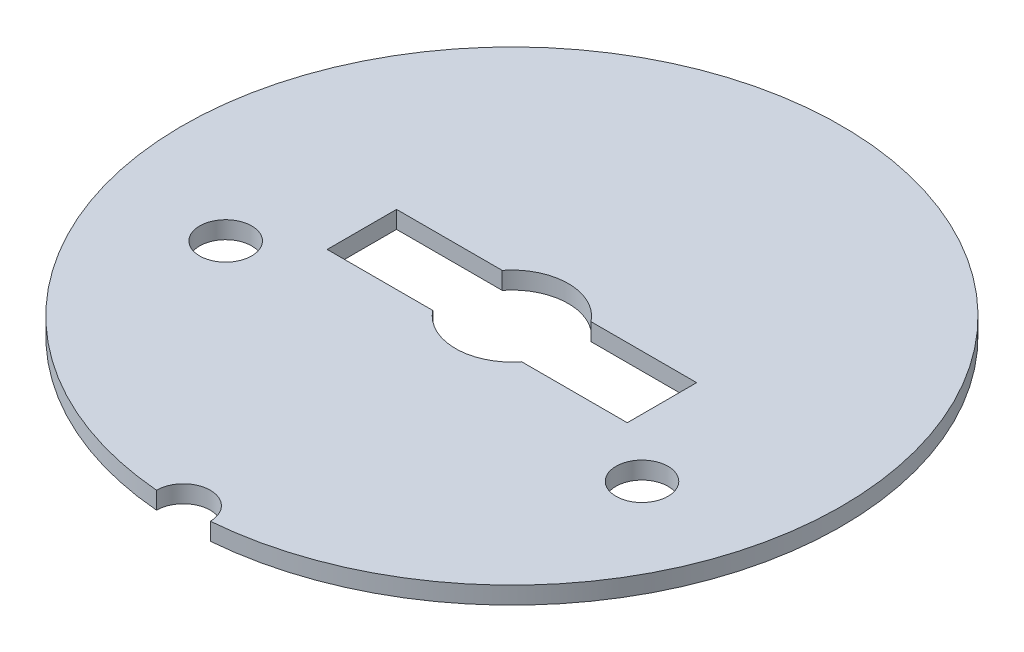
ISO-10303-21;
HEADER;
FILE_DESCRIPTION(('STEP AP214'),'2;1');
FILE_NAME('part.step','',(''),(''),'','','');
FILE_SCHEMA(('AUTOMOTIVE_DESIGN { 1 0 10303 214 1 1 1 1 }'));
ENDSEC;
DATA;
#1=APPLICATION_CONTEXT('core data for automotive mechanical design processes');
#2=APPLICATION_PROTOCOL_DEFINITION('international standard','automotive_design',2000,#1);
#3=PRODUCT_CONTEXT('',#1,'mechanical');
#4=PRODUCT('Part','Part','',(#3));
#5=PRODUCT_RELATED_PRODUCT_CATEGORY('part','',(#4));
#6=PRODUCT_DEFINITION_FORMATION('','',#4);
#7=PRODUCT_DEFINITION_CONTEXT('part definition',#1,'design');
#8=PRODUCT_DEFINITION('design','',#6,#7);
#9=PRODUCT_DEFINITION_SHAPE('','',#8);
#10=(LENGTH_UNIT() NAMED_UNIT(*) SI_UNIT(.MILLI.,.METRE.));
#11=(NAMED_UNIT(*) PLANE_ANGLE_UNIT() SI_UNIT($,.RADIAN.));
#12=(NAMED_UNIT(*) SI_UNIT($,.STERADIAN.) SOLID_ANGLE_UNIT());
#13=UNCERTAINTY_MEASURE_WITH_UNIT(LENGTH_MEASURE(1.E-05),#10,'distance_accuracy_value','');
#14=(GEOMETRIC_REPRESENTATION_CONTEXT(3) GLOBAL_UNCERTAINTY_ASSIGNED_CONTEXT((#13)) GLOBAL_UNIT_ASSIGNED_CONTEXT((#10,
#11,#12)) REPRESENTATION_CONTEXT('',''));
#15=CARTESIAN_POINT('',(0.,0.,0.));
#16=DIRECTION('',(0.,0.,1.));
#17=DIRECTION('',(1.,0.,0.));
#18=AXIS2_PLACEMENT_3D('',#15,#16,#17);
#19=CARTESIAN_POINT('',(0.,20.32,24.0495718828839));
#20=DIRECTION('',(0.,1.,0.));
#21=DIRECTION('',(0.,0.,1.));
#22=AXIS2_PLACEMENT_3D('',#19,#20,#21);
#23=PLANE('',#22);
#24=CARTESIAN_POINT('',(-30.48,20.32,11.43));
#25=DIRECTION('',(0.,1.,0.));
#26=DIRECTION('',(0.,0.,1.));
#27=AXIS2_PLACEMENT_3D('',#24,#25,#26);
#28=CIRCLE('',#27,3.81);
#29=CARTESIAN_POINT('',(-30.48,20.32,15.24));
#30=VERTEX_POINT('',#29);
#31=EDGE_CURVE('E132',#30,#30,#28,.F.);
#32=ORIENTED_EDGE('',*,*,#31,.T.);
#33=EDGE_LOOP('',(#32));
#34=FACE_BOUND('',#33,.T.);
#35=CARTESIAN_POINT('',(30.48,20.32,11.43));
#36=DIRECTION('',(0.,1.,0.));
#37=DIRECTION('',(0.,0.,1.));
#38=AXIS2_PLACEMENT_3D('',#35,#36,#37);
#39=CIRCLE('',#38,3.81);
#40=CARTESIAN_POINT('',(30.48,20.32,15.24));
#41=VERTEX_POINT('',#40);
#42=EDGE_CURVE('E155',#41,#41,#39,.F.);
#43=ORIENTED_EDGE('',*,*,#42,.T.);
#44=EDGE_LOOP('',(#43));
#45=FACE_BOUND('',#44,.T.);
#46=CARTESIAN_POINT('',(0.,20.32,48.0991437657678));
#47=DIRECTION('',(0.,-1.,0.));
#48=DIRECTION('',(0.,0.,1.));
#49=AXIS2_PLACEMENT_3D('',#46,#47,#48);
#50=CIRCLE('',#49,3.937);
#51=CARTESIAN_POINT('',(-3.937,20.32,48.0991437657678));
#52=VERTEX_POINT('',#51);
#53=CARTESIAN_POINT('',(3.937,20.32,48.0991437657678));
#54=VERTEX_POINT('',#53);
#55=EDGE_CURVE('E199',#52,#54,#50,.T.);
#56=ORIENTED_EDGE('',*,*,#55,.T.);
#57=CARTESIAN_POINT('',(0.,20.32,0.));
#58=DIRECTION('',(0.,1.,0.));
#59=DIRECTION('',(0.,0.,1.));
#60=AXIS2_PLACEMENT_3D('',#57,#58,#59);
#61=CIRCLE('',#60,48.26);
#62=EDGE_CURVE('E135',#54,#52,#61,.T.);
#63=ORIENTED_EDGE('',*,*,#62,.T.);
#64=EDGE_LOOP('',(#56,#63));
#65=FACE_BOUND('',#64,.T.);
#66=CARTESIAN_POINT('',(0.,20.32,0.));
#67=DIRECTION('',(0.,1.,0.));
#68=DIRECTION('',(0.,0.,1.));
#69=AXIS2_PLACEMENT_3D('',#66,#67,#68);
#70=CIRCLE('',#69,8.255);
#71=CARTESIAN_POINT('',(-6.50681373638434,20.32,-5.08));
#72=VERTEX_POINT('',#71);
#73=CARTESIAN_POINT('',(6.50681373638434,20.32,-5.08));
#74=VERTEX_POINT('',#73);
#75=EDGE_CURVE('E147',#72,#74,#70,.F.);
#76=ORIENTED_EDGE('',*,*,#75,.T.);
#77=DIRECTION('',(1.,0.,0.));
#78=VECTOR('',#77,1.);
#79=CARTESIAN_POINT('',(0.,20.32,-5.08));
#80=LINE('',#79,#78);
#81=CARTESIAN_POINT('',(21.971,20.32,-5.08));
#82=VERTEX_POINT('',#81);
#83=EDGE_CURVE('E190',#74,#82,#80,.T.);
#84=ORIENTED_EDGE('',*,*,#83,.T.);
#85=DIRECTION('',(0.,0.,1.));
#86=VECTOR('',#85,1.);
#87=CARTESIAN_POINT('',(21.971,20.32,24.0495718828839));
#88=LINE('',#87,#86);
#89=CARTESIAN_POINT('',(21.971,20.32,5.08));
#90=VERTEX_POINT('',#89);
#91=EDGE_CURVE('E150',#82,#90,#88,.T.);
#92=ORIENTED_EDGE('',*,*,#91,.T.);
#93=DIRECTION('',(-1.,0.,0.));
#94=VECTOR('',#93,1.);
#95=CARTESIAN_POINT('',(0.,20.32,5.08));
#96=LINE('',#95,#94);
#97=CARTESIAN_POINT('',(6.50681373638434,20.32,5.08));
#98=VERTEX_POINT('',#97);
#99=EDGE_CURVE('E181',#90,#98,#96,.T.);
#100=ORIENTED_EDGE('',*,*,#99,.T.);
#101=CARTESIAN_POINT('',(-6.50681373638434,20.32,5.08));
#102=VERTEX_POINT('',#101);
#103=EDGE_CURVE('E125',#98,#102,#70,.F.);
#104=ORIENTED_EDGE('',*,*,#103,.T.);
#105=CARTESIAN_POINT('',(-21.971,20.32,5.08));
#106=VERTEX_POINT('',#105);
#107=EDGE_CURVE('E177',#102,#106,#96,.T.);
#108=ORIENTED_EDGE('',*,*,#107,.T.);
#109=DIRECTION('',(0.,0.,-1.));
#110=VECTOR('',#109,1.);
#111=CARTESIAN_POINT('',(-21.971,20.32,24.0495718828839));
#112=LINE('',#111,#110);
#113=CARTESIAN_POINT('',(-21.971,20.32,-5.08));
#114=VERTEX_POINT('',#113);
#115=EDGE_CURVE('E184',#106,#114,#112,.T.);
#116=ORIENTED_EDGE('',*,*,#115,.T.);
#117=EDGE_CURVE('E194',#114,#72,#80,.T.);
#118=ORIENTED_EDGE('',*,*,#117,.T.);
#119=EDGE_LOOP('',(#76,#84,#92,#100,#104,#108,#116,#118));
#120=FACE_BOUND('',#119,.T.);
#121=ADVANCED_FACE('F37',(#34,#45,#65,#120),#23,.T.);
#122=CARTESIAN_POINT('',(21.971,38.608,5.08));
#123=DIRECTION('',(-1.,0.,0.));
#124=DIRECTION('',(0.,0.,1.));
#125=AXIS2_PLACEMENT_3D('',#122,#123,#124);
#126=PLANE('',#125);
#127=DIRECTION('',(0.,-1.,0.));
#128=VECTOR('',#127,1.);
#129=CARTESIAN_POINT('',(21.971,38.608,-5.08));
#130=LINE('',#129,#128);
#131=CARTESIAN_POINT('',(21.971,17.78,-5.08));
#132=VERTEX_POINT('',#131);
#133=EDGE_CURVE('E173',#82,#132,#130,.T.);
#134=ORIENTED_EDGE('',*,*,#133,.T.);
#135=DIRECTION('',(0.,0.,1.));
#136=VECTOR('',#135,1.);
#137=CARTESIAN_POINT('',(21.971,17.78,0.));
#138=LINE('',#137,#136);
#139=CARTESIAN_POINT('',(21.971,17.78,5.08));
#140=VERTEX_POINT('',#139);
#141=EDGE_CURVE('E46',#132,#140,#138,.T.);
#142=ORIENTED_EDGE('',*,*,#141,.T.);
#143=DIRECTION('',(0.,-1.,0.));
#144=VECTOR('',#143,1.);
#145=CARTESIAN_POINT('',(21.971,38.608,5.08));
#146=LINE('',#145,#144);
#147=EDGE_CURVE('E55',#90,#140,#146,.T.);
#148=ORIENTED_EDGE('',*,*,#147,.F.);
#149=ORIENTED_EDGE('',*,*,#91,.F.);
#150=EDGE_LOOP('',(#134,#142,#148,#149));
#151=FACE_BOUND('',#150,.T.);
#152=ADVANCED_FACE('F203',(#151),#126,.T.);
#153=CARTESIAN_POINT('',(-21.971,38.608,5.08));
#154=DIRECTION('',(0.,0.,-1.));
#155=DIRECTION('',(-1.,0.,0.));
#156=AXIS2_PLACEMENT_3D('',#153,#154,#155);
#157=PLANE('',#156);
#158=ORIENTED_EDGE('',*,*,#147,.T.);
#159=DIRECTION('',(-1.,0.,0.));
#160=VECTOR('',#159,1.);
#161=CARTESIAN_POINT('',(0.,17.78,5.08));
#162=LINE('',#161,#160);
#163=CARTESIAN_POINT('',(6.50681373638435,17.78,5.08));
#164=VERTEX_POINT('',#163);
#165=EDGE_CURVE('E141',#140,#164,#162,.T.);
#166=ORIENTED_EDGE('',*,*,#165,.T.);
#167=DIRECTION('',(0.,-1.,0.));
#168=VECTOR('',#167,1.);
#169=CARTESIAN_POINT('',(6.50681373638434,50.038,5.08));
#170=LINE('',#169,#168);
#171=EDGE_CURVE('E180',#98,#164,#170,.T.);
#172=ORIENTED_EDGE('',*,*,#171,.F.);
#173=ORIENTED_EDGE('',*,*,#99,.F.);
#174=EDGE_LOOP('',(#158,#166,#172,#173));
#175=FACE_BOUND('',#174,.T.);
#176=ADVANCED_FACE('F253',(#175),#157,.T.);
#177=CARTESIAN_POINT('',(0.,50.038,0.));
#178=DIRECTION('',(0.,-1.,0.));
#179=DIRECTION('',(0.,0.,-1.));
#180=AXIS2_PLACEMENT_3D('',#177,#178,#179);
#181=CYLINDRICAL_SURFACE('',#180,8.255);
#182=ORIENTED_EDGE('',*,*,#103,.F.);
#183=ORIENTED_EDGE('',*,*,#171,.T.);
#184=CARTESIAN_POINT('',(0.,17.78,0.));
#185=DIRECTION('',(0.,1.,0.));
#186=DIRECTION('',(0.,0.,1.));
#187=AXIS2_PLACEMENT_3D('',#184,#185,#186);
#188=CIRCLE('',#187,8.255);
#189=CARTESIAN_POINT('',(-6.50681373638435,17.78,5.08));
#190=VERTEX_POINT('',#189);
#191=EDGE_CURVE('E148',#190,#164,#188,.T.);
#192=ORIENTED_EDGE('',*,*,#191,.F.);
#193=DIRECTION('',(0.,-1.,0.));
#194=VECTOR('',#193,1.);
#195=CARTESIAN_POINT('',(-6.50681373638434,50.038,5.08));
#196=LINE('',#195,#194);
#197=EDGE_CURVE('E63',#190,#102,#196,.F.);
#198=ORIENTED_EDGE('',*,*,#197,.T.);
#199=EDGE_LOOP('',(#182,#183,#192,#198));
#200=FACE_BOUND('',#199,.T.);
#201=ADVANCED_FACE('F224',(#200),#181,.F.);
#202=ORIENTED_EDGE('',*,*,#197,.F.);
#203=CARTESIAN_POINT('',(-21.971,17.78,5.08));
#204=VERTEX_POINT('',#203);
#205=EDGE_CURVE('E137',#190,#204,#162,.T.);
#206=ORIENTED_EDGE('',*,*,#205,.T.);
#207=DIRECTION('',(0.,-1.,0.));
#208=VECTOR('',#207,1.);
#209=CARTESIAN_POINT('',(-21.971,38.608,5.08));
#210=LINE('',#209,#208);
#211=EDGE_CURVE('E167',#106,#204,#210,.T.);
#212=ORIENTED_EDGE('',*,*,#211,.F.);
#213=ORIENTED_EDGE('',*,*,#107,.F.);
#214=EDGE_LOOP('',(#202,#206,#212,#213));
#215=FACE_BOUND('',#214,.T.);
#216=ADVANCED_FACE('F228',(#215),#157,.T.);
#217=CARTESIAN_POINT('',(-21.971,38.608,5.08));
#218=DIRECTION('',(1.,0.,0.));
#219=DIRECTION('',(0.,0.,-1.));
#220=AXIS2_PLACEMENT_3D('',#217,#218,#219);
#221=PLANE('',#220);
#222=ORIENTED_EDGE('',*,*,#211,.T.);
#223=DIRECTION('',(0.,0.,-1.));
#224=VECTOR('',#223,1.);
#225=CARTESIAN_POINT('',(-21.971,17.78,0.));
#226=LINE('',#225,#224);
#227=CARTESIAN_POINT('',(-21.971,17.78,-5.08));
#228=VERTEX_POINT('',#227);
#229=EDGE_CURVE('E139',#204,#228,#226,.T.);
#230=ORIENTED_EDGE('',*,*,#229,.T.);
#231=DIRECTION('',(0.,-1.,0.));
#232=VECTOR('',#231,1.);
#233=CARTESIAN_POINT('',(-21.971,38.608,-5.08));
#234=LINE('',#233,#232);
#235=EDGE_CURVE('E170',#114,#228,#234,.T.);
#236=ORIENTED_EDGE('',*,*,#235,.F.);
#237=ORIENTED_EDGE('',*,*,#115,.F.);
#238=EDGE_LOOP('',(#222,#230,#236,#237));
#239=FACE_BOUND('',#238,.T.);
#240=ADVANCED_FACE('F230',(#239),#221,.T.);
#241=CARTESIAN_POINT('',(-21.971,38.608,-5.08));
#242=DIRECTION('',(0.,0.,1.));
#243=DIRECTION('',(1.,0.,0.));
#244=AXIS2_PLACEMENT_3D('',#241,#242,#243);
#245=PLANE('',#244);
#246=ORIENTED_EDGE('',*,*,#235,.T.);
#247=DIRECTION('',(1.,0.,0.));
#248=VECTOR('',#247,1.);
#249=CARTESIAN_POINT('',(0.,17.78,-5.08));
#250=LINE('',#249,#248);
#251=CARTESIAN_POINT('',(-6.50681373638434,17.78,-5.08));
#252=VERTEX_POINT('',#251);
#253=EDGE_CURVE('E48',#228,#252,#250,.T.);
#254=ORIENTED_EDGE('',*,*,#253,.T.);
#255=DIRECTION('',(0.,-1.,0.));
#256=VECTOR('',#255,1.);
#257=CARTESIAN_POINT('',(-6.50681373638434,50.038,-5.08));
#258=LINE('',#257,#256);
#259=EDGE_CURVE('E193',#72,#252,#258,.T.);
#260=ORIENTED_EDGE('',*,*,#259,.F.);
#261=ORIENTED_EDGE('',*,*,#117,.F.);
#262=EDGE_LOOP('',(#246,#254,#260,#261));
#263=FACE_BOUND('',#262,.T.);
#264=ADVANCED_FACE('F233',(#263),#245,.T.);
#265=ORIENTED_EDGE('',*,*,#75,.F.);
#266=ORIENTED_EDGE('',*,*,#259,.T.);
#267=CARTESIAN_POINT('',(6.50681373638434,17.78,-5.08));
#268=VERTEX_POINT('',#267);
#269=EDGE_CURVE('E126',#268,#252,#188,.T.);
#270=ORIENTED_EDGE('',*,*,#269,.F.);
#271=DIRECTION('',(0.,-1.,0.));
#272=VECTOR('',#271,1.);
#273=CARTESIAN_POINT('',(6.50681373638434,50.038,-5.08));
#274=LINE('',#273,#272);
#275=EDGE_CURVE('E187',#268,#74,#274,.F.);
#276=ORIENTED_EDGE('',*,*,#275,.T.);
#277=EDGE_LOOP('',(#265,#266,#270,#276));
#278=FACE_BOUND('',#277,.T.);
#279=ADVANCED_FACE('F210',(#278),#181,.F.);
#280=ORIENTED_EDGE('',*,*,#275,.F.);
#281=EDGE_CURVE('E11',#268,#132,#250,.T.);
#282=ORIENTED_EDGE('',*,*,#281,.T.);
#283=ORIENTED_EDGE('',*,*,#133,.F.);
#284=ORIENTED_EDGE('',*,*,#83,.F.);
#285=EDGE_LOOP('',(#280,#282,#283,#284));
#286=FACE_BOUND('',#285,.T.);
#287=ADVANCED_FACE('F215',(#286),#245,.T.);
#288=CARTESIAN_POINT('',(0.,20.32,0.));
#289=DIRECTION('',(0.,-1.,0.));
#290=DIRECTION('',(0.,0.,-1.));
#291=AXIS2_PLACEMENT_3D('',#288,#289,#290);
#292=CYLINDRICAL_SURFACE('',#291,48.26);
#293=CARTESIAN_POINT('',(0.,17.78,0.));
#294=DIRECTION('',(0.,-1.,0.));
#295=DIRECTION('',(0.,0.,-1.));
#296=AXIS2_PLACEMENT_3D('',#293,#294,#295);
#297=CIRCLE('',#296,48.26);
#298=CARTESIAN_POINT('',(-3.937,17.78,48.0991437657678));
#299=VERTEX_POINT('',#298);
#300=CARTESIAN_POINT('',(3.937,17.78,48.0991437657678));
#301=VERTEX_POINT('',#300);
#302=EDGE_CURVE('E128',#299,#301,#297,.T.);
#303=ORIENTED_EDGE('',*,*,#302,.F.);
#304=DIRECTION('',(0.,-1.,0.));
#305=VECTOR('',#304,1.);
#306=CARTESIAN_POINT('',(-3.937,20.32,48.0991437657678));
#307=LINE('',#306,#305);
#308=EDGE_CURVE('E122',#52,#299,#307,.T.);
#309=ORIENTED_EDGE('',*,*,#308,.F.);
#310=ORIENTED_EDGE('',*,*,#62,.F.);
#311=DIRECTION('',(0.,-1.,0.));
#312=VECTOR('',#311,1.);
#313=CARTESIAN_POINT('',(3.937,20.32,48.0991437657678));
#314=LINE('',#313,#312);
#315=EDGE_CURVE('E120',#54,#301,#314,.T.);
#316=ORIENTED_EDGE('',*,*,#315,.T.);
#317=EDGE_LOOP('',(#303,#309,#310,#316));
#318=FACE_BOUND('',#317,.T.);
#319=ADVANCED_FACE('F134',(#318),#292,.T.);
#320=CARTESIAN_POINT('',(0.,17.78,0.));
#321=DIRECTION('',(0.,1.,0.));
#322=DIRECTION('',(0.,0.,1.));
#323=AXIS2_PLACEMENT_3D('',#320,#321,#322);
#324=PLANE('',#323);
#325=CARTESIAN_POINT('',(-30.48,17.78,11.43));
#326=DIRECTION('',(0.,1.,0.));
#327=DIRECTION('',(0.,0.,1.));
#328=AXIS2_PLACEMENT_3D('',#325,#326,#327);
#329=CIRCLE('',#328,3.81);
#330=CARTESIAN_POINT('',(-30.48,17.78,15.24));
#331=VERTEX_POINT('',#330);
#332=EDGE_CURVE('E41',#331,#331,#329,.F.);
#333=ORIENTED_EDGE('',*,*,#332,.F.);
#334=EDGE_LOOP('',(#333));
#335=FACE_BOUND('',#334,.T.);
#336=CARTESIAN_POINT('',(30.48,17.78,11.43));
#337=DIRECTION('',(0.,1.,0.));
#338=DIRECTION('',(0.,0.,1.));
#339=AXIS2_PLACEMENT_3D('',#336,#337,#338);
#340=CIRCLE('',#339,3.81);
#341=CARTESIAN_POINT('',(30.48,17.78,15.24));
#342=VERTEX_POINT('',#341);
#343=EDGE_CURVE('E153',#342,#342,#340,.F.);
#344=ORIENTED_EDGE('',*,*,#343,.F.);
#345=EDGE_LOOP('',(#344));
#346=FACE_BOUND('',#345,.T.);
#347=CARTESIAN_POINT('',(0.,17.78,48.0991437657678));
#348=DIRECTION('',(0.,1.,0.));
#349=DIRECTION('',(0.,0.,1.));
#350=AXIS2_PLACEMENT_3D('',#347,#348,#349);
#351=CIRCLE('',#350,3.937);
#352=EDGE_CURVE('E116',#299,#301,#351,.F.);
#353=ORIENTED_EDGE('',*,*,#352,.F.);
#354=ORIENTED_EDGE('',*,*,#302,.T.);
#355=EDGE_LOOP('',(#353,#354));
#356=FACE_BOUND('',#355,.T.);
#357=ORIENTED_EDGE('',*,*,#281,.F.);
#358=ORIENTED_EDGE('',*,*,#269,.T.);
#359=ORIENTED_EDGE('',*,*,#253,.F.);
#360=ORIENTED_EDGE('',*,*,#229,.F.);
#361=ORIENTED_EDGE('',*,*,#205,.F.);
#362=ORIENTED_EDGE('',*,*,#191,.T.);
#363=ORIENTED_EDGE('',*,*,#165,.F.);
#364=ORIENTED_EDGE('',*,*,#141,.F.);
#365=EDGE_LOOP('',(#357,#358,#359,#360,#361,#362,#363,#364));
#366=FACE_BOUND('',#365,.T.);
#367=ADVANCED_FACE('F129',(#335,#346,#356,#366),#324,.F.);
#368=CARTESIAN_POINT('',(0.,20.32,48.0991437657678));
#369=DIRECTION('',(0.,-1.,0.));
#370=DIRECTION('',(0.,0.,-1.));
#371=AXIS2_PLACEMENT_3D('',#368,#369,#370);
#372=CYLINDRICAL_SURFACE('',#371,3.937);
#373=ORIENTED_EDGE('',*,*,#308,.T.);
#374=ORIENTED_EDGE('',*,*,#352,.T.);
#375=ORIENTED_EDGE('',*,*,#315,.F.);
#376=ORIENTED_EDGE('',*,*,#55,.F.);
#377=EDGE_LOOP('',(#373,#374,#375,#376));
#378=FACE_BOUND('',#377,.T.);
#379=ADVANCED_FACE('F39',(#378),#372,.F.);
#380=CARTESIAN_POINT('',(30.48,39.37,11.43));
#381=DIRECTION('',(0.,-1.,0.));
#382=DIRECTION('',(0.,0.,-1.));
#383=AXIS2_PLACEMENT_3D('',#380,#381,#382);
#384=CYLINDRICAL_SURFACE('',#383,3.81);
#385=ORIENTED_EDGE('',*,*,#42,.F.);
#386=EDGE_LOOP('',(#385));
#387=FACE_BOUND('',#386,.T.);
#388=ORIENTED_EDGE('',*,*,#343,.T.);
#389=EDGE_LOOP('',(#388));
#390=FACE_BOUND('',#389,.T.);
#391=ADVANCED_FACE('F311',(#387,#390),#384,.F.);
#392=CARTESIAN_POINT('',(-30.48,39.37,11.43));
#393=DIRECTION('',(0.,-1.,0.));
#394=DIRECTION('',(0.,0.,-1.));
#395=AXIS2_PLACEMENT_3D('',#392,#393,#394);
#396=CYLINDRICAL_SURFACE('',#395,3.81);
#397=ORIENTED_EDGE('',*,*,#31,.F.);
#398=EDGE_LOOP('',(#397));
#399=FACE_BOUND('',#398,.T.);
#400=ORIENTED_EDGE('',*,*,#332,.T.);
#401=EDGE_LOOP('',(#400));
#402=FACE_BOUND('',#401,.T.);
#403=ADVANCED_FACE('F320',(#399,#402),#396,.F.);
#404=CLOSED_SHELL('',(#121,#152,#176,#201,#216,#240,#264,#279,#287,#319,#367,#379,#391,#403));
#405=MANIFOLD_SOLID_BREP('B2',#404);
#406=ADVANCED_BREP_SHAPE_REPRESENTATION('',(#18,#405),#14);
#407=SHAPE_DEFINITION_REPRESENTATION(#9,#406);
ENDSEC;
END-ISO-10303-21;
